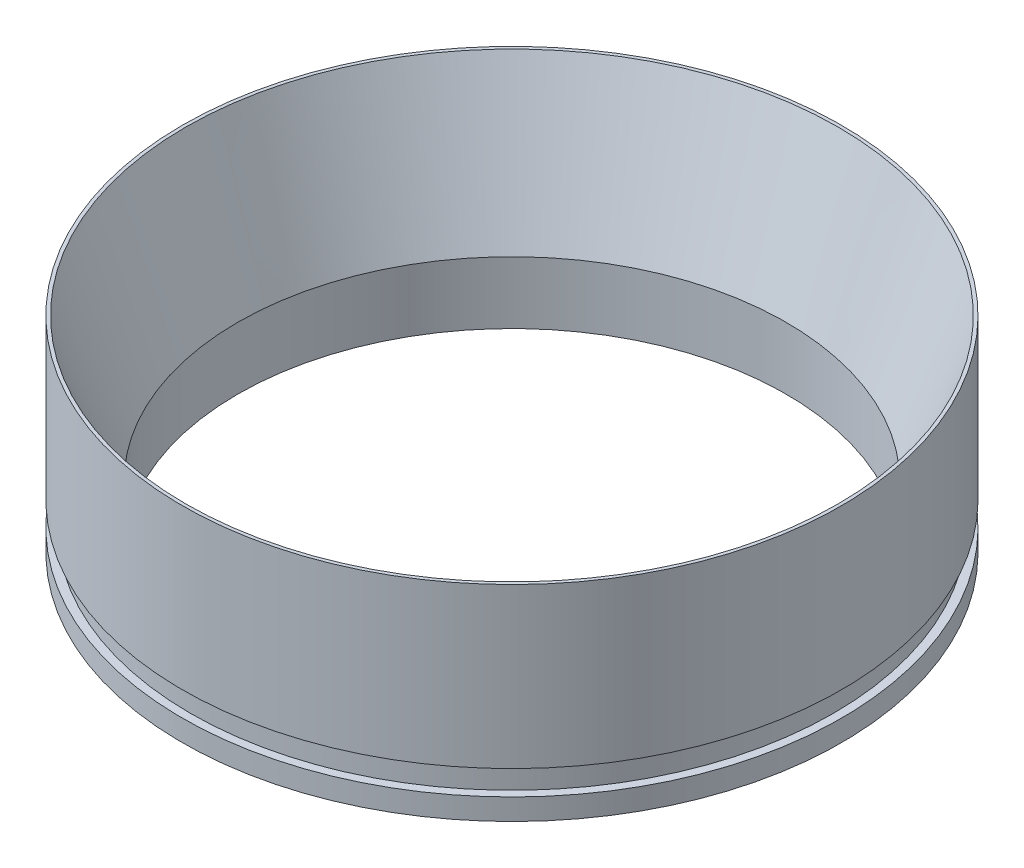
ISO-10303-21;
HEADER;
FILE_DESCRIPTION(('STEP AP214'),'2;1');
FILE_NAME('part.step','',(''),(''),'','','');
FILE_SCHEMA(('AUTOMOTIVE_DESIGN { 1 0 10303 214 1 1 1 1 }'));
ENDSEC;
DATA;
#1=APPLICATION_CONTEXT('core data for automotive mechanical design processes');
#2=APPLICATION_PROTOCOL_DEFINITION('international standard','automotive_design',2000,#1);
#3=PRODUCT_CONTEXT('',#1,'mechanical');
#4=PRODUCT('Part','Part','',(#3));
#5=PRODUCT_RELATED_PRODUCT_CATEGORY('part','',(#4));
#6=PRODUCT_DEFINITION_FORMATION('','',#4);
#7=PRODUCT_DEFINITION_CONTEXT('part definition',#1,'design');
#8=PRODUCT_DEFINITION('design','',#6,#7);
#9=PRODUCT_DEFINITION_SHAPE('','',#8);
#10=(LENGTH_UNIT() NAMED_UNIT(*) SI_UNIT(.MILLI.,.METRE.));
#11=(NAMED_UNIT(*) PLANE_ANGLE_UNIT() SI_UNIT($,.RADIAN.));
#12=(NAMED_UNIT(*) SI_UNIT($,.STERADIAN.) SOLID_ANGLE_UNIT());
#13=UNCERTAINTY_MEASURE_WITH_UNIT(LENGTH_MEASURE(1.E-05),#10,'distance_accuracy_value','');
#14=(GEOMETRIC_REPRESENTATION_CONTEXT(3) GLOBAL_UNCERTAINTY_ASSIGNED_CONTEXT((#13)) GLOBAL_UNIT_ASSIGNED_CONTEXT((#10,
#11,#12)) REPRESENTATION_CONTEXT('',''));
#15=CARTESIAN_POINT('',(0.,0.,0.));
#16=DIRECTION('',(0.,0.,1.));
#17=DIRECTION('',(1.,0.,0.));
#18=AXIS2_PLACEMENT_3D('',#15,#16,#17);
#19=CARTESIAN_POINT('',(0.,33.2396431415018,0.));
#20=DIRECTION('',(0.,1.,0.));
#21=DIRECTION('',(-1.,0.,0.));
#22=AXIS2_PLACEMENT_3D('',#19,#20,#21);
#23=CYLINDRICAL_SURFACE('',#22,51.1302);
#24=CARTESIAN_POINT('',(0.,0.,0.));
#25=DIRECTION('',(0.,1.,0.));
#26=DIRECTION('',(-1.,0.,0.));
#27=AXIS2_PLACEMENT_3D('',#24,#25,#26);
#28=CIRCLE('',#27,51.1302);
#29=CARTESIAN_POINT('',(-51.1302,0.,0.));
#30=VERTEX_POINT('',#29);
#31=EDGE_CURVE('E64',#30,#30,#28,.T.);
#32=ORIENTED_EDGE('',*,*,#31,.T.);
#33=EDGE_LOOP('',(#32));
#34=FACE_BOUND('',#33,.T.);
#35=CARTESIAN_POINT('',(0.,3.302,0.));
#36=DIRECTION('',(0.,1.,0.));
#37=DIRECTION('',(-1.,0.,0.));
#38=AXIS2_PLACEMENT_3D('',#35,#36,#37);
#39=CIRCLE('',#38,51.1302);
#40=CARTESIAN_POINT('',(-51.1302,3.302,0.));
#41=VERTEX_POINT('',#40);
#42=EDGE_CURVE('E10',#41,#41,#39,.T.);
#43=ORIENTED_EDGE('',*,*,#42,.F.);
#44=EDGE_LOOP('',(#43));
#45=FACE_BOUND('',#44,.T.);
#46=ADVANCED_FACE('F33',(#34,#45),#23,.T.);
#47=CARTESIAN_POINT('',(0.,3.302,0.));
#48=DIRECTION('',(0.,1.,0.));
#49=DIRECTION('',(-1.,0.,0.));
#50=AXIS2_PLACEMENT_3D('',#47,#48,#49);
#51=PLANE('',#50);
#52=ORIENTED_EDGE('',*,*,#42,.T.);
#53=EDGE_LOOP('',(#52));
#54=FACE_BOUND('',#53,.T.);
#55=CARTESIAN_POINT('',(0.,3.302,0.));
#56=DIRECTION('',(0.,1.,0.));
#57=DIRECTION('',(-1.,0.,0.));
#58=AXIS2_PLACEMENT_3D('',#55,#56,#57);
#59=CIRCLE('',#58,49.8602);
#60=CARTESIAN_POINT('',(-49.8602,3.302,0.));
#61=VERTEX_POINT('',#60);
#62=EDGE_CURVE('E39',#61,#61,#59,.T.);
#63=ORIENTED_EDGE('',*,*,#62,.F.);
#64=EDGE_LOOP('',(#63));
#65=FACE_BOUND('',#64,.T.);
#66=ADVANCED_FACE('F82',(#54,#65),#51,.T.);
#67=CARTESIAN_POINT('',(0.,33.2396431415018,0.));
#68=DIRECTION('',(0.,1.,0.));
#69=DIRECTION('',(-1.,0.,0.));
#70=AXIS2_PLACEMENT_3D('',#67,#68,#69);
#71=CYLINDRICAL_SURFACE('',#70,49.8602);
#72=ORIENTED_EDGE('',*,*,#62,.T.);
#73=EDGE_LOOP('',(#72));
#74=FACE_BOUND('',#73,.T.);
#75=CARTESIAN_POINT('',(0.,7.112,0.));
#76=DIRECTION('',(0.,1.,0.));
#77=DIRECTION('',(-1.,0.,0.));
#78=AXIS2_PLACEMENT_3D('',#75,#76,#77);
#79=CIRCLE('',#78,49.8602);
#80=CARTESIAN_POINT('',(-49.8602,7.112,0.));
#81=VERTEX_POINT('',#80);
#82=EDGE_CURVE('E43',#81,#81,#79,.T.);
#83=ORIENTED_EDGE('',*,*,#82,.F.);
#84=EDGE_LOOP('',(#83));
#85=FACE_BOUND('',#84,.T.);
#86=ADVANCED_FACE('F86',(#74,#85),#71,.T.);
#87=CARTESIAN_POINT('',(0.,7.112,0.));
#88=DIRECTION('',(0.,-1.,0.));
#89=DIRECTION('',(1.,0.,0.));
#90=AXIS2_PLACEMENT_3D('',#87,#88,#89);
#91=PLANE('',#90);
#92=ORIENTED_EDGE('',*,*,#82,.T.);
#93=EDGE_LOOP('',(#92));
#94=FACE_BOUND('',#93,.T.);
#95=CARTESIAN_POINT('',(0.,7.112,0.));
#96=DIRECTION('',(0.,1.,0.));
#97=DIRECTION('',(-1.,0.,0.));
#98=AXIS2_PLACEMENT_3D('',#95,#96,#97);
#99=CIRCLE('',#98,51.1302);
#100=CARTESIAN_POINT('',(-51.1302,7.112,0.));
#101=VERTEX_POINT('',#100);
#102=EDGE_CURVE('E47',#101,#101,#99,.T.);
#103=ORIENTED_EDGE('',*,*,#102,.F.);
#104=EDGE_LOOP('',(#103));
#105=FACE_BOUND('',#104,.T.);
#106=ADVANCED_FACE('F90',(#94,#105),#91,.T.);
#107=CARTESIAN_POINT('',(0.,33.2396431415018,0.));
#108=DIRECTION('',(0.,1.,0.));
#109=DIRECTION('',(-1.,0.,0.));
#110=AXIS2_PLACEMENT_3D('',#107,#108,#109);
#111=CYLINDRICAL_SURFACE('',#110,51.1302);
#112=ORIENTED_EDGE('',*,*,#102,.T.);
#113=EDGE_LOOP('',(#112));
#114=FACE_BOUND('',#113,.T.);
#115=CARTESIAN_POINT('',(0.,31.8439246124188,0.));
#116=DIRECTION('',(0.,1.,0.));
#117=DIRECTION('',(-1.,0.,0.));
#118=AXIS2_PLACEMENT_3D('',#115,#116,#117);
#119=CIRCLE('',#118,51.1302);
#120=CARTESIAN_POINT('',(-51.1302,31.8439246124188,0.));
#121=VERTEX_POINT('',#120);
#122=EDGE_CURVE('E52',#121,#121,#119,.T.);
#123=ORIENTED_EDGE('',*,*,#122,.F.);
#124=EDGE_LOOP('',(#123));
#125=FACE_BOUND('',#124,.T.);
#126=ADVANCED_FACE('F96',(#114,#125),#111,.T.);
#127=CARTESIAN_POINT('',(0.,31.8439246124188,0.));
#128=DIRECTION('',(0.,1.,0.));
#129=DIRECTION('',(-1.,0.,0.));
#130=AXIS2_PLACEMENT_3D('',#127,#128,#129);
#131=PLANE('',#130);
#132=ORIENTED_EDGE('',*,*,#122,.T.);
#133=EDGE_LOOP('',(#132));
#134=FACE_BOUND('',#133,.T.);
#135=CARTESIAN_POINT('',(0.,31.8439246124188,0.));
#136=DIRECTION('',(0.,1.,0.));
#137=DIRECTION('',(-1.,0.,0.));
#138=AXIS2_PLACEMENT_3D('',#135,#136,#137);
#139=CIRCLE('',#138,50.6222);
#140=CARTESIAN_POINT('',(-50.6222,31.8439246124188,0.));
#141=VERTEX_POINT('',#140);
#142=EDGE_CURVE('E55',#141,#141,#139,.T.);
#143=ORIENTED_EDGE('',*,*,#142,.F.);
#144=EDGE_LOOP('',(#143));
#145=FACE_BOUND('',#144,.T.);
#146=ADVANCED_FACE('F100',(#134,#145),#131,.T.);
#147=CARTESIAN_POINT('',(0.,9.652,0.));
#148=DIRECTION('',(0.,1.,0.));
#149=DIRECTION('',(-1.,0.,0.));
#150=AXIS2_PLACEMENT_3D('',#147,#148,#149);
#151=CONICAL_SURFACE('',#150,42.545,0.349065850398866);
#152=ORIENTED_EDGE('',*,*,#142,.T.);
#153=EDGE_LOOP('',(#152));
#154=FACE_BOUND('',#153,.T.);
#155=CARTESIAN_POINT('',(0.,9.652,0.));
#156=DIRECTION('',(0.,1.,0.));
#157=DIRECTION('',(-1.,0.,0.));
#158=AXIS2_PLACEMENT_3D('',#155,#156,#157);
#159=CIRCLE('',#158,42.545);
#160=CARTESIAN_POINT('',(-42.545,9.652,0.));
#161=VERTEX_POINT('',#160);
#162=EDGE_CURVE('E58',#161,#161,#159,.T.);
#163=ORIENTED_EDGE('',*,*,#162,.F.);
#164=EDGE_LOOP('',(#163));
#165=FACE_BOUND('',#164,.T.);
#166=ADVANCED_FACE('F78',(#154,#165),#151,.F.);
#167=CARTESIAN_POINT('',(0.,33.2396431415018,0.));
#168=DIRECTION('',(0.,1.,0.));
#169=DIRECTION('',(-1.,0.,0.));
#170=AXIS2_PLACEMENT_3D('',#167,#168,#169);
#171=CYLINDRICAL_SURFACE('',#170,42.545);
#172=CARTESIAN_POINT('',(0.,0.,0.));
#173=DIRECTION('',(0.,1.,0.));
#174=DIRECTION('',(-1.,0.,0.));
#175=AXIS2_PLACEMENT_3D('',#172,#173,#174);
#176=CIRCLE('',#175,42.545);
#177=CARTESIAN_POINT('',(-42.545,0.,0.));
#178=VERTEX_POINT('',#177);
#179=EDGE_CURVE('E61',#178,#178,#176,.T.);
#180=ORIENTED_EDGE('',*,*,#179,.F.);
#181=EDGE_LOOP('',(#180));
#182=FACE_BOUND('',#181,.T.);
#183=ORIENTED_EDGE('',*,*,#162,.T.);
#184=EDGE_LOOP('',(#183));
#185=FACE_BOUND('',#184,.T.);
#186=ADVANCED_FACE('F72',(#182,#185),#171,.F.);
#187=CARTESIAN_POINT('',(0.,0.,0.));
#188=DIRECTION('',(0.,-1.,0.));
#189=DIRECTION('',(1.,0.,0.));
#190=AXIS2_PLACEMENT_3D('',#187,#188,#189);
#191=PLANE('',#190);
#192=ORIENTED_EDGE('',*,*,#179,.T.);
#193=EDGE_LOOP('',(#192));
#194=FACE_BOUND('',#193,.T.);
#195=ORIENTED_EDGE('',*,*,#31,.F.);
#196=EDGE_LOOP('',(#195));
#197=FACE_BOUND('',#196,.T.);
#198=ADVANCED_FACE('F70',(#194,#197),#191,.T.);
#199=CLOSED_SHELL('',(#46,#66,#86,#106,#126,#146,#166,#186,#198));
#200=MANIFOLD_SOLID_BREP('B2',#199);
#201=ADVANCED_BREP_SHAPE_REPRESENTATION('',(#18,#200),#14);
#202=SHAPE_DEFINITION_REPRESENTATION(#9,#201);
ENDSEC;
END-ISO-10303-21;
